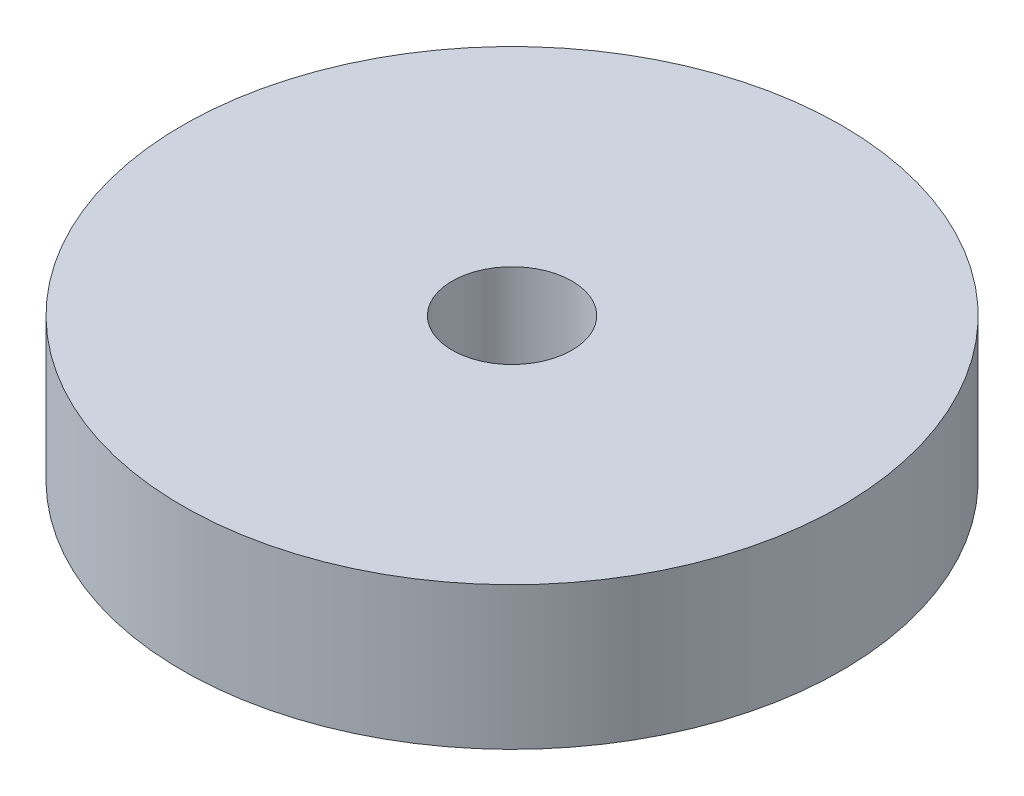
ISO-10303-21;
HEADER;
FILE_DESCRIPTION(('STEP AP214'),'2;1');
FILE_NAME('part.step','',(''),(''),'','','');
FILE_SCHEMA(('AUTOMOTIVE_DESIGN { 1 0 10303 214 1 1 1 1 }'));
ENDSEC;
DATA;
#1=APPLICATION_CONTEXT('core data for automotive mechanical design processes');
#2=APPLICATION_PROTOCOL_DEFINITION('international standard','automotive_design',2000,#1);
#3=PRODUCT_CONTEXT('',#1,'mechanical');
#4=PRODUCT('Part','Part','',(#3));
#5=PRODUCT_RELATED_PRODUCT_CATEGORY('part','',(#4));
#6=PRODUCT_DEFINITION_FORMATION('','',#4);
#7=PRODUCT_DEFINITION_CONTEXT('part definition',#1,'design');
#8=PRODUCT_DEFINITION('design','',#6,#7);
#9=PRODUCT_DEFINITION_SHAPE('','',#8);
#10=(LENGTH_UNIT() NAMED_UNIT(*) SI_UNIT(.MILLI.,.METRE.));
#11=(NAMED_UNIT(*) PLANE_ANGLE_UNIT() SI_UNIT($,.RADIAN.));
#12=(NAMED_UNIT(*) SI_UNIT($,.STERADIAN.) SOLID_ANGLE_UNIT());
#13=UNCERTAINTY_MEASURE_WITH_UNIT(LENGTH_MEASURE(1.E-05),#10,'distance_accuracy_value','');
#14=(GEOMETRIC_REPRESENTATION_CONTEXT(3) GLOBAL_UNCERTAINTY_ASSIGNED_CONTEXT((#13)) GLOBAL_UNIT_ASSIGNED_CONTEXT((#10,
#11,#12)) REPRESENTATION_CONTEXT('',''));
#15=CARTESIAN_POINT('',(0.,0.,0.));
#16=DIRECTION('',(0.,0.,1.));
#17=DIRECTION('',(1.,0.,0.));
#18=AXIS2_PLACEMENT_3D('',#15,#16,#17);
#19=CARTESIAN_POINT('',(0.,-3.175,0.));
#20=DIRECTION('',(0.,-1.,0.));
#21=DIRECTION('',(0.,0.,-1.));
#22=AXIS2_PLACEMENT_3D('',#19,#20,#21);
#23=CYLINDRICAL_SURFACE('',#22,2.54);
#24=CARTESIAN_POINT('',(0.,0.,0.));
#25=DIRECTION('',(0.,-1.,0.));
#26=DIRECTION('',(0.,0.,-1.));
#27=AXIS2_PLACEMENT_3D('',#24,#25,#26);
#28=CIRCLE('',#27,2.54);
#29=CARTESIAN_POINT('',(0.,0.,-2.54));
#30=VERTEX_POINT('',#29);
#31=EDGE_CURVE('E10',#30,#30,#28,.T.);
#32=ORIENTED_EDGE('',*,*,#31,.F.);
#33=EDGE_LOOP('',(#32));
#34=FACE_BOUND('',#33,.T.);
#35=CARTESIAN_POINT('',(0.,-6.0452,0.));
#36=DIRECTION('',(0.,-1.,0.));
#37=DIRECTION('',(0.,0.,-1.));
#38=AXIS2_PLACEMENT_3D('',#35,#36,#37);
#39=CIRCLE('',#38,2.54);
#40=CARTESIAN_POINT('',(0.,-6.0452,-2.54));
#41=VERTEX_POINT('',#40);
#42=EDGE_CURVE('E42',#41,#41,#39,.T.);
#43=ORIENTED_EDGE('',*,*,#42,.T.);
#44=EDGE_LOOP('',(#43));
#45=FACE_BOUND('',#44,.T.);
#46=ADVANCED_FACE('F28',(#34,#45),#23,.F.);
#47=CARTESIAN_POINT('',(0.,0.,-2.54));
#48=DIRECTION('',(0.,-1.,0.));
#49=DIRECTION('',(0.,0.,-1.));
#50=AXIS2_PLACEMENT_3D('',#47,#48,#49);
#51=PLANE('',#50);
#52=CARTESIAN_POINT('',(0.,0.,0.));
#53=DIRECTION('',(0.,-1.,0.));
#54=DIRECTION('',(0.,0.,-1.));
#55=AXIS2_PLACEMENT_3D('',#52,#53,#54);
#56=CIRCLE('',#55,13.97);
#57=CARTESIAN_POINT('',(0.,0.,-13.97));
#58=VERTEX_POINT('',#57);
#59=EDGE_CURVE('E34',#58,#58,#56,.T.);
#60=ORIENTED_EDGE('',*,*,#59,.F.);
#61=EDGE_LOOP('',(#60));
#62=FACE_BOUND('',#61,.T.);
#63=ORIENTED_EDGE('',*,*,#31,.T.);
#64=EDGE_LOOP('',(#63));
#65=FACE_BOUND('',#64,.T.);
#66=ADVANCED_FACE('F57',(#62,#65),#51,.F.);
#67=CARTESIAN_POINT('',(0.,-3.175,0.));
#68=DIRECTION('',(0.,-1.,0.));
#69=DIRECTION('',(0.,0.,-1.));
#70=AXIS2_PLACEMENT_3D('',#67,#68,#69);
#71=CYLINDRICAL_SURFACE('',#70,13.97);
#72=CARTESIAN_POINT('',(0.,-6.0452,0.));
#73=DIRECTION('',(0.,-1.,0.));
#74=DIRECTION('',(0.,0.,-1.));
#75=AXIS2_PLACEMENT_3D('',#72,#73,#74);
#76=CIRCLE('',#75,13.97);
#77=CARTESIAN_POINT('',(0.,-6.0452,-13.97));
#78=VERTEX_POINT('',#77);
#79=EDGE_CURVE('E38',#78,#78,#76,.T.);
#80=ORIENTED_EDGE('',*,*,#79,.F.);
#81=EDGE_LOOP('',(#80));
#82=FACE_BOUND('',#81,.T.);
#83=ORIENTED_EDGE('',*,*,#59,.T.);
#84=EDGE_LOOP('',(#83));
#85=FACE_BOUND('',#84,.T.);
#86=ADVANCED_FACE('F52',(#82,#85),#71,.T.);
#87=CARTESIAN_POINT('',(0.,-6.0452,-13.97));
#88=DIRECTION('',(0.,1.,0.));
#89=DIRECTION('',(0.,0.,1.));
#90=AXIS2_PLACEMENT_3D('',#87,#88,#89);
#91=PLANE('',#90);
#92=ORIENTED_EDGE('',*,*,#42,.F.);
#93=EDGE_LOOP('',(#92));
#94=FACE_BOUND('',#93,.T.);
#95=ORIENTED_EDGE('',*,*,#79,.T.);
#96=EDGE_LOOP('',(#95));
#97=FACE_BOUND('',#96,.T.);
#98=ADVANCED_FACE('F49',(#94,#97),#91,.F.);
#99=CLOSED_SHELL('',(#46,#66,#86,#98));
#100=MANIFOLD_SOLID_BREP('B2',#99);
#101=ADVANCED_BREP_SHAPE_REPRESENTATION('',(#18,#100),#14);
#102=SHAPE_DEFINITION_REPRESENTATION(#9,#101);
ENDSEC;
END-ISO-10303-21;
